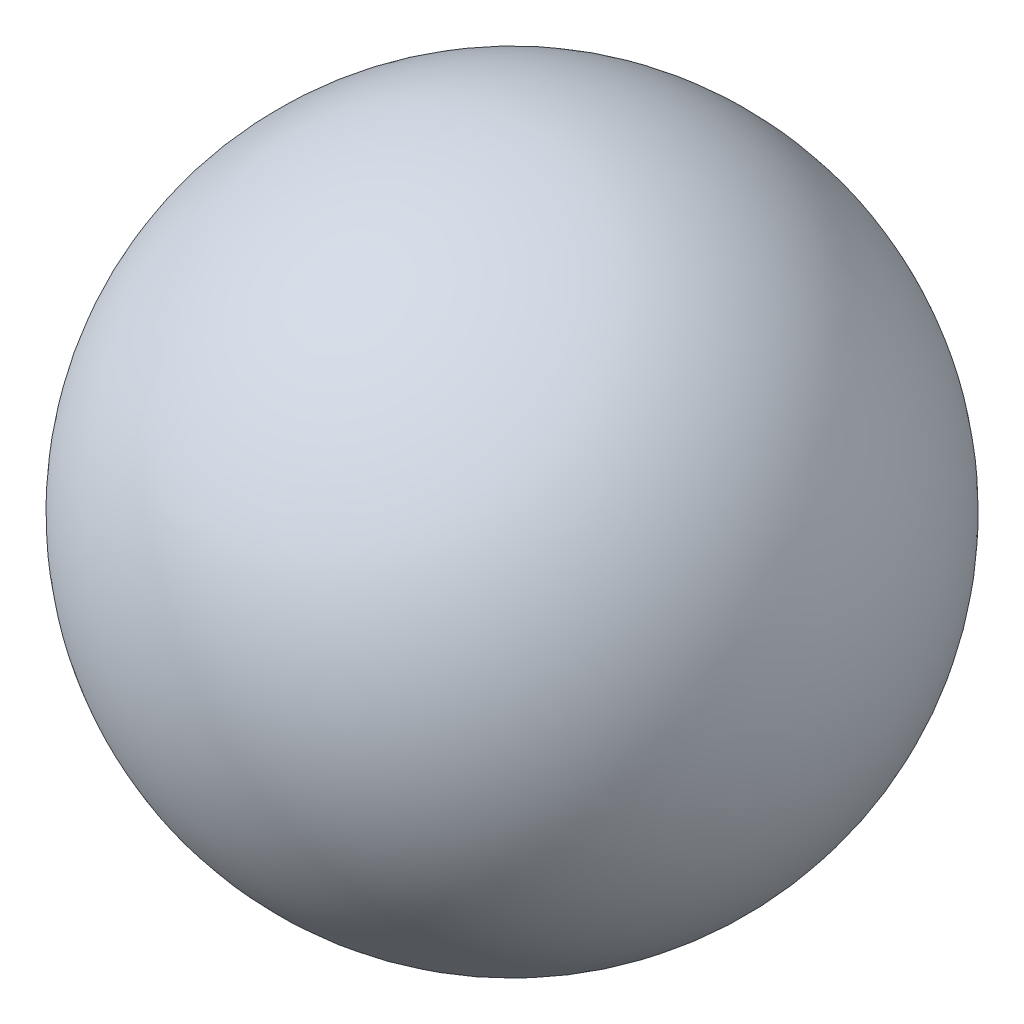
ISO-10303-21;
HEADER;
FILE_DESCRIPTION(('STEP AP214'),'2;1');
FILE_NAME('part.step','',(''),(''),'','','');
FILE_SCHEMA(('AUTOMOTIVE_DESIGN { 1 0 10303 214 1 1 1 1 }'));
ENDSEC;
DATA;
#1=APPLICATION_CONTEXT('core data for automotive mechanical design processes');
#2=APPLICATION_PROTOCOL_DEFINITION('international standard','automotive_design',2000,#1);
#3=PRODUCT_CONTEXT('',#1,'mechanical');
#4=PRODUCT('Part','Part','',(#3));
#5=PRODUCT_RELATED_PRODUCT_CATEGORY('part','',(#4));
#6=PRODUCT_DEFINITION_FORMATION('','',#4);
#7=PRODUCT_DEFINITION_CONTEXT('part definition',#1,'design');
#8=PRODUCT_DEFINITION('design','',#6,#7);
#9=PRODUCT_DEFINITION_SHAPE('','',#8);
#10=(LENGTH_UNIT() NAMED_UNIT(*) SI_UNIT(.MILLI.,.METRE.));
#11=(NAMED_UNIT(*) PLANE_ANGLE_UNIT() SI_UNIT($,.RADIAN.));
#12=(NAMED_UNIT(*) SI_UNIT($,.STERADIAN.) SOLID_ANGLE_UNIT());
#13=UNCERTAINTY_MEASURE_WITH_UNIT(LENGTH_MEASURE(1.E-05),#10,'distance_accuracy_value','');
#14=(GEOMETRIC_REPRESENTATION_CONTEXT(3) GLOBAL_UNCERTAINTY_ASSIGNED_CONTEXT((#13)) GLOBAL_UNIT_ASSIGNED_CONTEXT((#10,
#11,#12)) REPRESENTATION_CONTEXT('',''));
#15=CARTESIAN_POINT('',(0.,0.,0.));
#16=DIRECTION('',(0.,0.,1.));
#17=DIRECTION('',(1.,0.,0.));
#18=AXIS2_PLACEMENT_3D('',#15,#16,#17);
#19=CARTESIAN_POINT('',(0.,0.,0.));
#20=DIRECTION('',(0.,0.,1.));
#21=DIRECTION('',(-1.,0.,0.));
#22=AXIS2_PLACEMENT_3D('',#19,#20,#21);
#23=SPHERICAL_SURFACE('',#22,2.25);
#24=CARTESIAN_POINT('',(0.,0.,2.25));
#25=VERTEX_POINT('',#24);
#26=VERTEX_LOOP('',#25);
#27=FACE_BOUND('',#26,.T.);
#28=ADVANCED_FACE('F29',(#27),#23,.T.);
#29=CLOSED_SHELL('',(#28));
#30=MANIFOLD_SOLID_BREP('B2',#29);
#31=ADVANCED_BREP_SHAPE_REPRESENTATION('',(#18,#30),#14);
#32=SHAPE_DEFINITION_REPRESENTATION(#9,#31);
ENDSEC;
END-ISO-10303-21;
